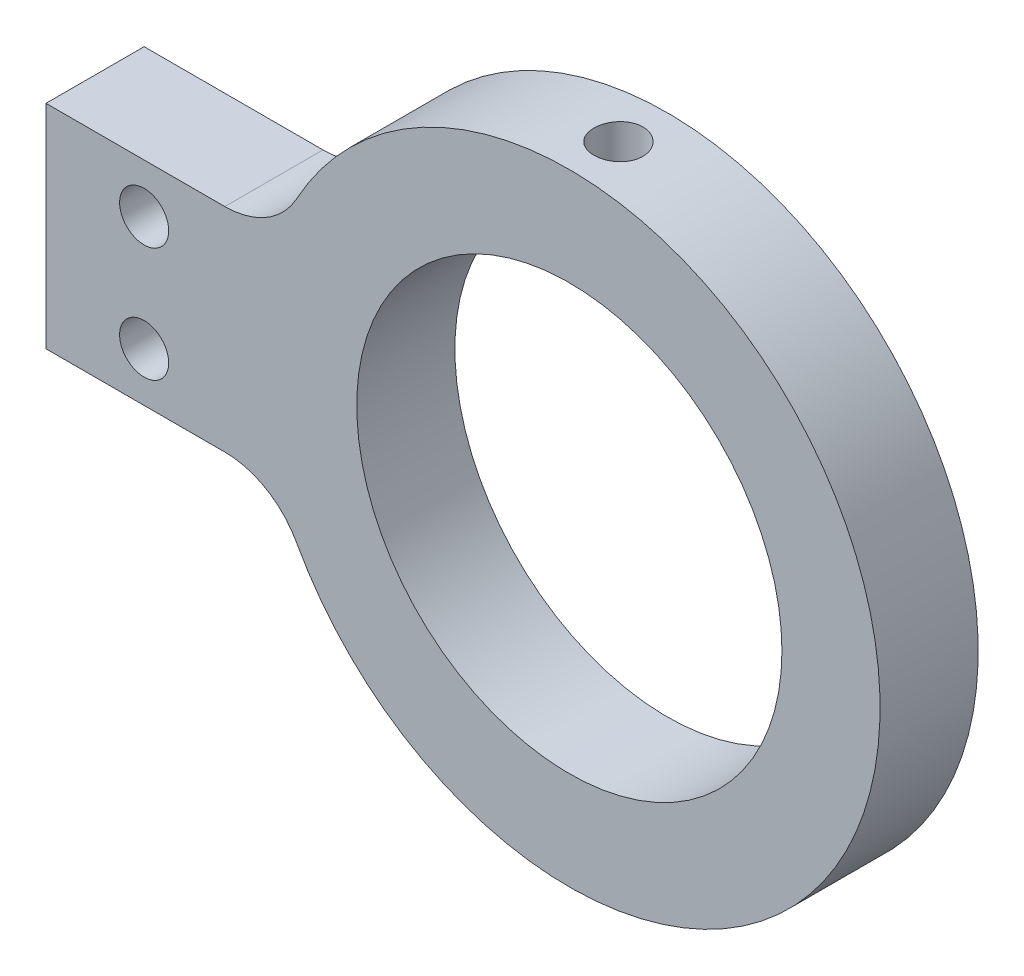
ISO-10303-21;
HEADER;
FILE_DESCRIPTION(('STEP AP214'),'2;1');
FILE_NAME('part.step','',(''),(''),'','','');
FILE_SCHEMA(('AUTOMOTIVE_DESIGN { 1 0 10303 214 1 1 1 1 }'));
ENDSEC;
DATA;
#1=APPLICATION_CONTEXT('core data for automotive mechanical design processes');
#2=APPLICATION_PROTOCOL_DEFINITION('international standard','automotive_design',2000,#1);
#3=PRODUCT_CONTEXT('',#1,'mechanical');
#4=PRODUCT('Part','Part','',(#3));
#5=PRODUCT_RELATED_PRODUCT_CATEGORY('part','',(#4));
#6=PRODUCT_DEFINITION_FORMATION('','',#4);
#7=PRODUCT_DEFINITION_CONTEXT('part definition',#1,'design');
#8=PRODUCT_DEFINITION('design','',#6,#7);
#9=PRODUCT_DEFINITION_SHAPE('','',#8);
#10=(LENGTH_UNIT() NAMED_UNIT(*) SI_UNIT(.MILLI.,.METRE.));
#11=(NAMED_UNIT(*) PLANE_ANGLE_UNIT() SI_UNIT($,.RADIAN.));
#12=(NAMED_UNIT(*) SI_UNIT($,.STERADIAN.) SOLID_ANGLE_UNIT());
#13=UNCERTAINTY_MEASURE_WITH_UNIT(LENGTH_MEASURE(1.E-05),#10,'distance_accuracy_value','');
#14=(GEOMETRIC_REPRESENTATION_CONTEXT(3) GLOBAL_UNCERTAINTY_ASSIGNED_CONTEXT((#13)) GLOBAL_UNIT_ASSIGNED_CONTEXT((#10,
#11,#12)) REPRESENTATION_CONTEXT('',''));
#15=CARTESIAN_POINT('',(0.,0.,0.));
#16=DIRECTION('',(0.,0.,1.));
#17=DIRECTION('',(1.,0.,0.));
#18=AXIS2_PLACEMENT_3D('',#15,#16,#17);
#19=CARTESIAN_POINT('',(0.,0.,3.));
#20=DIRECTION('',(0.,0.,-1.));
#21=DIRECTION('',(-1.,0.,0.));
#22=AXIS2_PLACEMENT_3D('',#19,#20,#21);
#23=CYLINDRICAL_SURFACE('',#22,19.);
#24=CARTESIAN_POINT('',(0.,0.,-3.));
#25=DIRECTION('',(0.,0.,1.));
#26=DIRECTION('',(1.,0.,0.));
#27=AXIS2_PLACEMENT_3D('',#24,#25,#26);
#28=CIRCLE('',#27,19.);
#29=CARTESIAN_POINT('',(-16.6767547594115,-9.10416666666666,-3.));
#30=VERTEX_POINT('',#29);
#31=CARTESIAN_POINT('',(-16.6767547594115,9.10416666666666,-3.));
#32=VERTEX_POINT('',#31);
#33=EDGE_CURVE('E112',#30,#32,#28,.T.);
#34=ORIENTED_EDGE('',*,*,#33,.T.);
#35=DIRECTION('',(0.,0.,-1.));
#36=VECTOR('',#35,1.);
#37=CARTESIAN_POINT('',(-16.6767547594115,9.10416666666666,3.));
#38=LINE('',#37,#36);
#39=CARTESIAN_POINT('',(-16.6767547594115,9.10416666666666,3.));
#40=VERTEX_POINT('',#39);
#41=EDGE_CURVE('E109',#40,#32,#38,.T.);
#42=ORIENTED_EDGE('',*,*,#41,.F.);
#43=CARTESIAN_POINT('',(0.,0.,3.));
#44=DIRECTION('',(0.,0.,1.));
#45=DIRECTION('',(1.,0.,0.));
#46=AXIS2_PLACEMENT_3D('',#43,#44,#45);
#47=CIRCLE('',#46,19.);
#48=CARTESIAN_POINT('',(-16.6767547594115,-9.10416666666666,3.));
#49=VERTEX_POINT('',#48);
#50=EDGE_CURVE('E97',#49,#40,#47,.T.);
#51=ORIENTED_EDGE('',*,*,#50,.F.);
#52=DIRECTION('',(0.,0.,-1.));
#53=VECTOR('',#52,1.);
#54=CARTESIAN_POINT('',(-16.6767547594115,-9.10416666666666,3.));
#55=LINE('',#54,#53);
#56=EDGE_CURVE('E113',#49,#30,#55,.T.);
#57=ORIENTED_EDGE('',*,*,#56,.T.);
#58=EDGE_LOOP('',(#34,#42,#51,#57));
#59=FACE_BOUND('',#58,.T.);
#60=CARTESIAN_POINT('',(0.,19.,-1.5));
#61=CARTESIAN_POINT('',(0.0841151387188532,18.999999221537,-1.49999631934173));
#62=CARTESIAN_POINT('',(0.168287922827548,18.9994354600354,-1.49290084958466));
#63=CARTESIAN_POINT('',(0.334305698598371,18.997240706404,-1.46469947465167));
#64=CARTESIAN_POINT('',(0.416147925046005,18.9956084974586,-1.44357759491472));
#65=CARTESIAN_POINT('',(0.575076027563788,18.9914613431667,-1.38793703178534));
#66=CARTESIAN_POINT('',(0.652164524677553,18.9889468894701,-1.35342580876111));
#67=CARTESIAN_POINT('',(0.799435680795712,18.9833174206842,-1.27199926981773));
#68=CARTESIAN_POINT('',(0.869619836810095,18.9802025362166,-1.22508665095823));
#69=CARTESIAN_POINT('',(1.00127051563137,18.9737138537755,-1.12007204663659));
#70=CARTESIAN_POINT('',(1.06271896083146,18.9703395405387,-1.06194742819675));
#71=CARTESIAN_POINT('',(1.1749989049417,18.9637166459802,-0.936206408029782));
#72=CARTESIAN_POINT('',(1.22582994292754,18.960468070122,-0.868589594439193));
#73=CARTESIAN_POINT('',(1.31549242293151,18.9544588143707,-0.725675328414236));
#74=CARTESIAN_POINT('',(1.3543081273485,18.951698776369,-0.650367973118573));
#75=CARTESIAN_POINT('',(1.41873755115466,18.9469848112354,-0.494279424529938));
#76=CARTESIAN_POINT('',(1.4443514822562,18.9450308711765,-0.413498319041156));
#77=CARTESIAN_POINT('',(1.48159822322927,18.9421545390237,-0.248935339909821));
#78=CARTESIAN_POINT('',(1.49326029941244,18.9412299879009,-0.165160128678885));
#79=CARTESIAN_POINT('',(1.50236268465663,18.9405102433779,0.00316340857499041));
#80=CARTESIAN_POINT('',(1.49980323578885,18.9407150307546,0.0877117214141516));
#81=CARTESIAN_POINT('',(1.48055943130006,18.9422288673013,0.254981155017642));
#82=CARTESIAN_POINT('',(1.46390684932512,18.9435354324364,0.337705956855369));
#83=CARTESIAN_POINT('',(1.41699882958061,18.9471017023429,0.499182607561633));
#84=CARTESIAN_POINT('',(1.38674327091875,18.9493614155851,0.57793442111453));
#85=CARTESIAN_POINT('',(1.31345245016364,18.9545822190074,0.729331074859556));
#86=CARTESIAN_POINT('',(1.2704028956484,18.9575440928322,0.801968967999395));
#87=CARTESIAN_POINT('',(1.17275641592226,18.9638347400174,0.938999893955222));
#88=CARTESIAN_POINT('',(1.11815928117868,18.9671635200349,1.00339277713015));
#89=CARTESIAN_POINT('',(0.998789069552185,18.9738239428695,1.12229057948029));
#90=CARTESIAN_POINT('',(0.933988517197367,18.9771555685343,1.17676791879317));
#91=CARTESIAN_POINT('',(0.796146882184882,18.9834375709718,1.27407509939559));
#92=CARTESIAN_POINT('',(0.723105794733443,18.9863879475227,1.31690493390936));
#93=CARTESIAN_POINT('',(0.570838809989568,18.991575496542,1.38969946273513));
#94=CARTESIAN_POINT('',(0.491612346167745,18.9938126035852,1.41966297696088));
#95=CARTESIAN_POINT('',(0.329231606345089,18.9973207725944,1.46585520971452));
#96=CARTESIAN_POINT('',(0.246077403532174,18.9985918525535,1.48208418405981));
#97=CARTESIAN_POINT('',(0.0784407393713425,19.0000224384176,1.50031217220341));
#98=CARTESIAN_POINT('',(-0.00603755448041892,19.0001849207592,1.50234928955241));
#99=CARTESIAN_POINT('',(-0.174134501687,18.9993879456588,1.49223549471702));
#100=CARTESIAN_POINT('',(-0.257753162221242,18.9984284975946,1.48008470112344));
#101=CARTESIAN_POINT('',(-0.421648876867877,18.9954975020934,1.44197157489794));
#102=CARTESIAN_POINT('',(-0.501930053359411,18.9935272459175,1.41602686183516));
#103=CARTESIAN_POINT('',(-0.656999501829893,18.9887960412095,1.35108034355391));
#104=CARTESIAN_POINT('',(-0.731787695596672,18.9860350814215,1.31207835246253));
#105=CARTESIAN_POINT('',(-0.873921875208904,18.9800247197833,1.22202835520065));
#106=CARTESIAN_POINT('',(-0.941251793864615,18.976774297697,1.17095505784873));
#107=CARTESIAN_POINT('',(-1.06639608992059,18.9701537726923,1.05824883025555));
#108=CARTESIAN_POINT('',(-1.12421031888409,18.9667836679079,0.996615735320939));
#109=CARTESIAN_POINT('',(-1.2288124248757,18.9602948383227,0.864374324175828));
#110=CARTESIAN_POINT('',(-1.27557547077564,18.9571766897926,0.793746334523397));
#111=CARTESIAN_POINT('',(-1.356577619136,18.9515527813904,0.645618147208736));
#112=CARTESIAN_POINT('',(-1.39081683559962,18.9490470159439,0.568118012110947));
#113=CARTESIAN_POINT('',(-1.44575693555035,18.94493468603,0.408534049893584));
#114=CARTESIAN_POINT('',(-1.46647311943612,18.9433271056248,0.326455517499473));
#115=CARTESIAN_POINT('',(-1.49382895011883,18.9411896745755,0.159971925186586));
#116=CARTESIAN_POINT('',(-1.50046883646069,18.9406598055914,0.075566904883834));
#117=CARTESIAN_POINT('',(-1.49948094344338,18.9407380213103,-0.092926929471462));
#118=CARTESIAN_POINT('',(-1.49189218322356,18.9413429939456,-0.177015976500801));
#119=CARTESIAN_POINT('',(-1.46274366938462,18.9436161189885,-0.342721436509556));
#120=CARTESIAN_POINT('',(-1.44118389337775,18.9452842730997,-0.424337845526495));
#121=CARTESIAN_POINT('',(-1.38471500507715,18.9494949902263,-0.582784498435055));
#122=CARTESIAN_POINT('',(-1.34980648222261,18.9520375146316,-0.659614953485356));
#123=CARTESIAN_POINT('',(-1.267635548191,18.9577105355609,-0.806330890474433));
#124=CARTESIAN_POINT('',(-1.22037336027397,18.9608410214587,-0.876216497891582));
#125=CARTESIAN_POINT('',(-1.11469031191135,18.967347409111,-1.007258401442));
#126=CARTESIAN_POINT('',(-1.05624065477126,18.9707239299605,-1.06839144257716));
#127=CARTESIAN_POINT('',(-0.92989212448948,18.977336317951,-1.18000278065208));
#128=CARTESIAN_POINT('',(-0.861990962632756,18.9805721507741,-1.23047848940779));
#129=CARTESIAN_POINT('',(-0.718548782250666,18.9865438065605,-1.31940271283776));
#130=CARTESIAN_POINT('',(-0.642994879159651,18.989278763737,-1.35783048218647));
#131=CARTESIAN_POINT('',(-0.486538032284914,18.9939300983643,-1.42140600094976));
#132=CARTESIAN_POINT('',(-0.405641386546964,18.9958474204367,-1.44656908316626));
#133=CARTESIAN_POINT('',(-0.270219385273123,18.9981528412889,-1.47646148286017));
#134=CARTESIAN_POINT('',(-0.216566049108645,18.9988423900528,-1.48527676958514));
#135=CARTESIAN_POINT('',(-0.108616487728126,18.9997662202352,-1.49704720975321));
#136=CARTESIAN_POINT('',(-0.0543202640171315,19.0000005027195,-1.50000237691255));
#137=CARTESIAN_POINT('',(0.,19.,-1.5));
#138=B_SPLINE_CURVE_WITH_KNOTS('',3,(#60,#61,#62,#63,#64,#65,#66,#67,#68,#69,#70,#71,#72,#73,
#74,#75,#76,#77,#78,#79,#80,#81,#82,#83,#84,#85,#86,#87,#88,#89,#90,#91,#92,#93,#94,#95,#96,#97,
#98,#99,#100,#101,#102,#103,#104,#105,#106,#107,#108,#109,#110,#111,#112,#113,#114,#115,#116,
#117,#118,#119,#120,#121,#122,#123,#124,#125,#126,#127,#128,#129,#130,#131,#132,#133,#134,#135,
#136,#137),.UNSPECIFIED.,.T.,.F.,(4,2,2,2,2,2,2,2,2,2,2,2,2,2,2,2,2,2,2,2,2,2,2,2,2,2,2,2,2,2,2,
2,2,2,2,2,2,2,4),(0.,0.252147094273371,0.504581850393633,0.756876154680071,1.00911563499452,
1.26186972745745,1.5146347902352,1.76772953561851,2.02082022208066,2.27337907304911,
2.52593362510898,2.77792029301404,3.02990920041797,3.28218067450637,3.53445672649365,
3.78742409874195,4.0403916181499,4.29338233453675,4.54636833865406,4.79867484092891,
5.05097923429394,5.30296211992513,5.55494859273475,5.80746776930199,6.05999088458261,
6.31307611620289,6.56615904395592,6.81895512684885,7.07174690772234,7.32384647280326,
7.57594644186007,7.82803528025071,8.08011956311296,8.33286165921681,8.58566506452426,
8.83890141074389,9.09184439276202,9.25467749271783,9.41751021154461),.UNSPECIFIED.);
#139=CARTESIAN_POINT('',(0.,19.,-1.5));
#140=VERTEX_POINT('',#139);
#141=EDGE_CURVE('E201',#140,#140,#138,.T.);
#142=ORIENTED_EDGE('',*,*,#141,.T.);
#143=EDGE_LOOP('',(#142));
#144=FACE_BOUND('',#143,.T.);
#145=ADVANCED_FACE('F36',(#59,#144),#23,.T.);
#146=CARTESIAN_POINT('',(0.,0.,3.));
#147=DIRECTION('',(0.,0.,-1.));
#148=DIRECTION('',(-1.,0.,0.));
#149=AXIS2_PLACEMENT_3D('',#146,#147,#148);
#150=CYLINDRICAL_SURFACE('',#149,13.);
#151=CARTESIAN_POINT('',(0.,0.,-3.));
#152=DIRECTION('',(0.,0.,1.));
#153=DIRECTION('',(1.,0.,0.));
#154=AXIS2_PLACEMENT_3D('',#151,#152,#153);
#155=CIRCLE('',#154,13.);
#156=CARTESIAN_POINT('',(13.,0.,-3.));
#157=VERTEX_POINT('',#156);
#158=EDGE_CURVE('E217',#157,#157,#155,.T.);
#159=ORIENTED_EDGE('',*,*,#158,.F.);
#160=EDGE_LOOP('',(#159));
#161=FACE_BOUND('',#160,.T.);
#162=CARTESIAN_POINT('',(0.,0.,3.));
#163=DIRECTION('',(0.,0.,1.));
#164=DIRECTION('',(1.,0.,0.));
#165=AXIS2_PLACEMENT_3D('',#162,#163,#164);
#166=CIRCLE('',#165,13.);
#167=CARTESIAN_POINT('',(13.,0.,3.));
#168=VERTEX_POINT('',#167);
#169=EDGE_CURVE('E126',#168,#168,#166,.T.);
#170=ORIENTED_EDGE('',*,*,#169,.T.);
#171=EDGE_LOOP('',(#170));
#172=FACE_BOUND('',#171,.T.);
#173=CARTESIAN_POINT('',(0.,13.,-1.5));
#174=CARTESIAN_POINT('',(0.0839563147427422,12.9999989044515,-1.4999964031671));
#175=CARTESIAN_POINT('',(0.167966345196187,12.999178081572,-1.4929275849652));
#176=CARTESIAN_POINT('',(0.333652235419372,12.995982599614,-1.46483826496663));
#177=CARTESIAN_POINT('',(0.415325505475653,12.9936062813601,-1.44380286531638));
#178=CARTESIAN_POINT('',(0.57391497224922,12.9875677351869,-1.38840533385725));
#179=CARTESIAN_POINT('',(0.650834199520698,12.9839063366207,-1.35405179569065));
#180=CARTESIAN_POINT('',(0.79779979378714,12.9757057473599,-1.27301111812132));
#181=CARTESIAN_POINT('',(0.867847413269117,12.9711667170809,-1.22632623210123));
#182=CARTESIAN_POINT('',(0.999427807179226,12.9616943551208,-1.12171196440118));
#183=CARTESIAN_POINT('',(1.06092347729183,12.9567594432832,-1.06373605262275));
#184=CARTESIAN_POINT('',(1.17333502414497,12.9470643855765,-0.938285163247563));
#185=CARTESIAN_POINT('',(1.2242503828419,12.9423042482743,-0.870809720796652));
#186=CARTESIAN_POINT('',(1.3141916873334,12.9334819604022,-0.728037336104839));
#187=CARTESIAN_POINT('',(1.3531833171573,12.9294218388056,-0.652718639922291));
#188=CARTESIAN_POINT('',(1.41795120910938,12.9224797052987,-0.496547838041185));
#189=CARTESIAN_POINT('',(1.44372790011126,12.9195976551562,-0.415695912012962));
#190=CARTESIAN_POINT('',(1.48122247723766,12.9153528047108,-0.251136475376288));
#191=CARTESIAN_POINT('',(1.49300261981048,12.9139832786549,-0.167443326259401));
#192=CARTESIAN_POINT('',(1.50236226854616,12.9128978570991,0.000742439544129054));
#193=CARTESIAN_POINT('',(1.49994226427626,12.9131819045903,0.085235028568845));
#194=CARTESIAN_POINT('',(1.48102150197295,12.9153653842397,0.252189313271096));
#195=CARTESIAN_POINT('',(1.46458907258954,12.9172569773873,0.334658869592594));
#196=CARTESIAN_POINT('',(1.41821640637187,12.9224301836669,0.495661894018248));
#197=CARTESIAN_POINT('',(1.38827593305336,12.9257118211342,0.574195293185667));
#198=CARTESIAN_POINT('',(1.31566282618376,12.9333043079058,0.725310469236094));
#199=CARTESIAN_POINT('',(1.27296024500285,12.9376175732259,0.797877729502273));
#200=CARTESIAN_POINT('',(1.17605655290097,12.9467853893456,0.934841729507241));
#201=CARTESIAN_POINT('',(1.12185499363063,12.9516399612475,0.999238150505508));
#202=CARTESIAN_POINT('',(1.0031120359915,12.9613782949516,1.11842928380831));
#203=CARTESIAN_POINT('',(0.938511694342139,12.9662620604919,1.17316529129794));
#204=CARTESIAN_POINT('',(0.80100859223603,12.9754816969276,1.27102561216758));
#205=CARTESIAN_POINT('',(0.728105817136099,12.9798175668567,1.31414990506731));
#206=CARTESIAN_POINT('',(0.576023905679871,12.9874550212078,1.38756171284481));
#207=CARTESIAN_POINT('',(0.496843118716625,12.9907563324875,1.41784583842859));
#208=CARTESIAN_POINT('',(0.334473831095743,12.9959501177405,1.46467252734239));
#209=CARTESIAN_POINT('',(0.251285490311374,12.9978426478647,1.48121563836297));
#210=CARTESIAN_POINT('',(0.0837704200050171,12.999998373659,1.50001527637962));
#211=CARTESIAN_POINT('',(-0.00054711354320089,13.0002707984128,1.50235272893189));
#212=CARTESIAN_POINT('',(-0.168372695685007,12.9991804669134,1.49288784538895));
#213=CARTESIAN_POINT('',(-0.251880758889224,12.9978177402298,1.48108576498777));
#214=CARTESIAN_POINT('',(-0.415480266956156,12.993616027243,1.443744027192));
#215=CARTESIAN_POINT('',(-0.495580568872891,12.9907811576039,1.41824267129123));
#216=CARTESIAN_POINT('',(-0.650367161714355,12.9839527929212,1.35426590377096));
#217=CARTESIAN_POINT('',(-0.725053293857113,12.9799592639147,1.31579011183556));
#218=CARTESIAN_POINT('',(-0.867254744569762,12.9712363785455,1.22675885487711));
#219=CARTESIAN_POINT('',(-0.934736878832462,12.9665038451426,1.17615070408719));
#220=CARTESIAN_POINT('',(-1.06027784673837,12.9568430886348,1.06436625518484));
#221=CARTESIAN_POINT('',(-1.11833636324618,12.9519148589511,1.00318960155086));
#222=CARTESIAN_POINT('',(-1.22366664140002,12.9423899602444,0.871649614664061));
#223=CARTESIAN_POINT('',(-1.27088497439797,12.9377950067668,0.801243356491106));
#224=CARTESIAN_POINT('',(-1.35282617315314,12.9294843210235,0.653452424155031));
#225=CARTESIAN_POINT('',(-1.38754925754463,12.9257685733744,0.576067872123489));
#226=CARTESIAN_POINT('',(-1.44342658284102,12.9196483466479,0.416693846264516));
#227=CARTESIAN_POINT('',(-1.46461162925533,12.91724089246,0.334715292069646));
#228=CARTESIAN_POINT('',(-1.49291104062265,12.9140010380224,0.16833506048564));
#229=CARTESIAN_POINT('',(-1.50002595610949,12.9131685761468,0.083933478035471));
#230=CARTESIAN_POINT('',(-1.49997405326828,12.9131745631781,-0.0843656537594237));
#231=CARTESIAN_POINT('',(-1.49289116482699,12.9140031925958,-0.168263241810996));
#232=CARTESIAN_POINT('',(-1.46482172327171,12.9172169582806,-0.333667501993218));
#233=CARTESIAN_POINT('',(-1.44383516225563,12.9196020954323,-0.415174172764976));
#234=CARTESIAN_POINT('',(-1.38857911797313,12.9256572251488,-0.573476091689344));
#235=CARTESIAN_POINT('',(-1.35431304208042,12.9293268880955,-0.650272542581184));
#236=CARTESIAN_POINT('',(-1.27347900341466,12.9375381901497,-0.797038400387884));
#237=CARTESIAN_POINT('',(-1.22691097725304,12.9420798337501,-0.867007772122138));
#238=CARTESIAN_POINT('',(-1.12248173071088,12.9515555600008,-0.998562953329314));
#239=CARTESIAN_POINT('',(-1.06455790771248,12.9564917239034,-1.06009892117499));
#240=CARTESIAN_POINT('',(-0.939190054186289,12.9661816355574,-1.17261111489076));
#241=CARTESIAN_POINT('',(-0.871743768617549,12.9709353397599,-1.22358483240877));
#242=CARTESIAN_POINT('',(-0.728996893197092,12.9797415177439,-1.31366356407028));
#243=CARTESIAN_POINT('',(-0.653671391511422,12.9837916526637,-1.35272930568544));
#244=CARTESIAN_POINT('',(-0.497527270565884,12.9907101076695,-1.41760310503946));
#245=CARTESIAN_POINT('',(-0.416714824913399,12.993579731148,-1.44342579213558));
#246=CARTESIAN_POINT('',(-0.27955630533205,12.9971099824635,-1.47479285483811));
#247=CARTESIAN_POINT('',(-0.224080319679961,12.9981885527758,-1.48423222713368));
#248=CARTESIAN_POINT('',(-0.112410914672188,12.9996339262189,-1.49683698528069));
#249=CARTESIAN_POINT('',(-0.0562174995863221,13.0000007335839,-1.50000240845436));
#250=CARTESIAN_POINT('',(0.,13.,-1.5));
#251=B_SPLINE_CURVE_WITH_KNOTS('',3,(#173,#174,#175,#176,#177,#178,#179,#180,#181,#182,#183,
#184,#185,#186,#187,#188,#189,#190,#191,#192,#193,#194,#195,#196,#197,#198,#199,#200,#201,#202,
#203,#204,#205,#206,#207,#208,#209,#210,#211,#212,#213,#214,#215,#216,#217,#218,#219,#220,#221,
#222,#223,#224,#225,#226,#227,#228,#229,#230,#231,#232,#233,#234,#235,#236,#237,#238,#239,#240,
#241,#242,#243,#244,#245,#246,#247,#248,#249,#250),.UNSPECIFIED.,.T.,.F.,(4,2,2,2,2,2,2,2,2,2,2,
2,2,2,2,2,2,2,2,2,2,2,2,2,2,2,2,2,2,2,2,2,2,2,2,2,2,2,4),(0.,0.251663624421979,
0.503596125244171,0.755366334321089,1.00709056767771,1.25987498270023,1.51267177188699,
1.76618939688668,2.0196987937799,2.27207631201581,2.52444512928255,2.77559031440111,
3.02673989646913,3.27848351780672,3.53023695652505,3.78347119880911,4.0367058877347,
4.29000737900444,4.54329877367693,4.79514587715501,5.04698842639316,5.29813049175019,
5.54927991940194,5.80154039645153,6.05380936112788,6.30729621090899,6.56077862511547,
6.81368217226278,7.0665758236448,7.31797891068329,7.56938214060554,7.82072090595902,
8.07206096641733,8.3248276967652,8.57765438622355,8.83130609524226,9.08467699305617,
9.25319301127889,9.42170802703663),.UNSPECIFIED.);
#252=CARTESIAN_POINT('',(0.,13.,-1.5));
#253=VERTEX_POINT('',#252);
#254=EDGE_CURVE('E196',#253,#253,#251,.T.);
#255=ORIENTED_EDGE('',*,*,#254,.F.);
#256=EDGE_LOOP('',(#255));
#257=FACE_BOUND('',#256,.T.);
#258=ADVANCED_FACE('F161',(#161,#172,#257),#150,.F.);
#259=CARTESIAN_POINT('',(-21.0653744329409,11.5,3.));
#260=DIRECTION('',(0.,0.,1.));
#261=DIRECTION('',(1.,0.,0.));
#262=AXIS2_PLACEMENT_3D('',#259,#260,#261);
#263=PLANE('',#262);
#264=CARTESIAN_POINT('',(-26.,3.5,3.));
#265=DIRECTION('',(0.,0.,1.));
#266=DIRECTION('',(1.,0.,0.));
#267=AXIS2_PLACEMENT_3D('',#264,#265,#266);
#268=CIRCLE('',#267,1.5);
#269=CARTESIAN_POINT('',(-24.5,3.5,3.));
#270=VERTEX_POINT('',#269);
#271=EDGE_CURVE('E214',#270,#270,#268,.T.);
#272=ORIENTED_EDGE('',*,*,#271,.F.);
#273=EDGE_LOOP('',(#272));
#274=FACE_BOUND('',#273,.T.);
#275=DIRECTION('',(0.,-1.,0.));
#276=VECTOR('',#275,1.);
#277=CARTESIAN_POINT('',(-32.,-6.50000000000001,3.));
#278=LINE('',#277,#276);
#279=CARTESIAN_POINT('',(-32.,6.49999999999999,3.));
#280=VERTEX_POINT('',#279);
#281=CARTESIAN_POINT('',(-32.,-6.50000000000001,3.));
#282=VERTEX_POINT('',#281);
#283=EDGE_CURVE('E133',#280,#282,#278,.T.);
#284=ORIENTED_EDGE('',*,*,#283,.T.);
#285=DIRECTION('',(1.,0.,0.));
#286=VECTOR('',#285,1.);
#287=CARTESIAN_POINT('',(-21.0653744329409,-6.5,3.));
#288=LINE('',#287,#286);
#289=CARTESIAN_POINT('',(-21.0653744329409,-6.5,3.));
#290=VERTEX_POINT('',#289);
#291=EDGE_CURVE('E90',#282,#290,#288,.T.);
#292=ORIENTED_EDGE('',*,*,#291,.T.);
#293=CARTESIAN_POINT('',(-21.0653744329409,-11.5,3.));
#294=DIRECTION('',(0.,0.,-1.));
#295=DIRECTION('',(-1.,0.,0.));
#296=AXIS2_PLACEMENT_3D('',#293,#294,#295);
#297=CIRCLE('',#296,5.);
#298=EDGE_CURVE('E104',#290,#49,#297,.T.);
#299=ORIENTED_EDGE('',*,*,#298,.T.);
#300=ORIENTED_EDGE('',*,*,#50,.T.);
#301=CARTESIAN_POINT('',(-21.0653744329409,11.5,3.));
#302=DIRECTION('',(0.,0.,-1.));
#303=DIRECTION('',(1.,0.,0.));
#304=AXIS2_PLACEMENT_3D('',#301,#302,#303);
#305=CIRCLE('',#304,5.);
#306=CARTESIAN_POINT('',(-21.0653744329409,6.5,3.));
#307=VERTEX_POINT('',#306);
#308=EDGE_CURVE('E102',#40,#307,#305,.T.);
#309=ORIENTED_EDGE('',*,*,#308,.T.);
#310=DIRECTION('',(-1.,0.,0.));
#311=VECTOR('',#310,1.);
#312=CARTESIAN_POINT('',(-21.0653744329409,6.5,3.));
#313=LINE('',#312,#311);
#314=EDGE_CURVE('E53',#307,#280,#313,.T.);
#315=ORIENTED_EDGE('',*,*,#314,.T.);
#316=EDGE_LOOP('',(#284,#292,#299,#300,#309,#315));
#317=FACE_BOUND('',#316,.T.);
#318=ORIENTED_EDGE('',*,*,#169,.F.);
#319=EDGE_LOOP('',(#318));
#320=FACE_BOUND('',#319,.T.);
#321=CARTESIAN_POINT('',(-26.,-3.5,3.));
#322=DIRECTION('',(0.,0.,1.));
#323=DIRECTION('',(-1.,0.,0.));
#324=AXIS2_PLACEMENT_3D('',#321,#322,#323);
#325=CIRCLE('',#324,1.5);
#326=CARTESIAN_POINT('',(-27.5,-3.5,3.));
#327=VERTEX_POINT('',#326);
#328=EDGE_CURVE('E207',#327,#327,#325,.T.);
#329=ORIENTED_EDGE('',*,*,#328,.F.);
#330=EDGE_LOOP('',(#329));
#331=FACE_BOUND('',#330,.T.);
#332=ADVANCED_FACE('F99',(#274,#317,#320,#331),#263,.T.);
#333=CARTESIAN_POINT('',(-21.0653744329409,11.5,-3.));
#334=DIRECTION('',(0.,0.,1.));
#335=DIRECTION('',(1.,0.,0.));
#336=AXIS2_PLACEMENT_3D('',#333,#334,#335);
#337=PLANE('',#336);
#338=DIRECTION('',(0.,-1.,0.));
#339=VECTOR('',#338,1.);
#340=CARTESIAN_POINT('',(-32.,-6.50000000000001,-3.));
#341=LINE('',#340,#339);
#342=CARTESIAN_POINT('',(-32.,6.49999999999999,-3.));
#343=VERTEX_POINT('',#342);
#344=CARTESIAN_POINT('',(-32.,-6.50000000000001,-3.));
#345=VERTEX_POINT('',#344);
#346=EDGE_CURVE('E122',#343,#345,#341,.T.);
#347=ORIENTED_EDGE('',*,*,#346,.F.);
#348=DIRECTION('',(-1.,0.,0.));
#349=VECTOR('',#348,1.);
#350=CARTESIAN_POINT('',(-21.0653744329409,6.5,-3.));
#351=LINE('',#350,#349);
#352=CARTESIAN_POINT('',(-21.0653744329409,6.5,-3.));
#353=VERTEX_POINT('',#352);
#354=EDGE_CURVE('E82',#353,#343,#351,.T.);
#355=ORIENTED_EDGE('',*,*,#354,.F.);
#356=CARTESIAN_POINT('',(-21.0653744329409,11.5,-3.));
#357=DIRECTION('',(0.,0.,-1.));
#358=DIRECTION('',(1.,0.,0.));
#359=AXIS2_PLACEMENT_3D('',#356,#357,#358);
#360=CIRCLE('',#359,5.);
#361=EDGE_CURVE('E76',#32,#353,#360,.T.);
#362=ORIENTED_EDGE('',*,*,#361,.F.);
#363=ORIENTED_EDGE('',*,*,#33,.F.);
#364=CARTESIAN_POINT('',(-21.0653744329409,-11.5,-3.));
#365=DIRECTION('',(0.,0.,-1.));
#366=DIRECTION('',(-1.,0.,0.));
#367=AXIS2_PLACEMENT_3D('',#364,#365,#366);
#368=CIRCLE('',#367,5.);
#369=CARTESIAN_POINT('',(-21.0653744329409,-6.5,-3.));
#370=VERTEX_POINT('',#369);
#371=EDGE_CURVE('E128',#370,#30,#368,.T.);
#372=ORIENTED_EDGE('',*,*,#371,.F.);
#373=DIRECTION('',(1.,0.,0.));
#374=VECTOR('',#373,1.);
#375=CARTESIAN_POINT('',(-21.0653744329409,-6.5,-3.));
#376=LINE('',#375,#374);
#377=EDGE_CURVE('E125',#345,#370,#376,.T.);
#378=ORIENTED_EDGE('',*,*,#377,.F.);
#379=EDGE_LOOP('',(#347,#355,#362,#363,#372,#378));
#380=FACE_BOUND('',#379,.T.);
#381=ORIENTED_EDGE('',*,*,#158,.T.);
#382=EDGE_LOOP('',(#381));
#383=FACE_BOUND('',#382,.T.);
#384=CARTESIAN_POINT('',(-26.,3.5,-3.));
#385=DIRECTION('',(0.,0.,1.));
#386=DIRECTION('',(1.,0.,0.));
#387=AXIS2_PLACEMENT_3D('',#384,#385,#386);
#388=CIRCLE('',#387,1.5);
#389=CARTESIAN_POINT('',(-24.5,3.5,-3.));
#390=VERTEX_POINT('',#389);
#391=EDGE_CURVE('E210',#390,#390,#388,.T.);
#392=ORIENTED_EDGE('',*,*,#391,.T.);
#393=EDGE_LOOP('',(#392));
#394=FACE_BOUND('',#393,.T.);
#395=CARTESIAN_POINT('',(-26.,-3.5,-3.));
#396=DIRECTION('',(0.,0.,1.));
#397=DIRECTION('',(-1.,0.,0.));
#398=AXIS2_PLACEMENT_3D('',#395,#396,#397);
#399=CIRCLE('',#398,1.5);
#400=CARTESIAN_POINT('',(-27.5,-3.5,-3.));
#401=VERTEX_POINT('',#400);
#402=EDGE_CURVE('E211',#401,#401,#399,.T.);
#403=ORIENTED_EDGE('',*,*,#402,.T.);
#404=EDGE_LOOP('',(#403));
#405=FACE_BOUND('',#404,.T.);
#406=ADVANCED_FACE('F142',(#380,#383,#394,#405),#337,.F.);
#407=CARTESIAN_POINT('',(-32.,-6.50000000000001,3.));
#408=DIRECTION('',(1.,0.,0.));
#409=DIRECTION('',(0.,0.,-1.));
#410=AXIS2_PLACEMENT_3D('',#407,#408,#409);
#411=PLANE('',#410);
#412=ORIENTED_EDGE('',*,*,#346,.T.);
#413=DIRECTION('',(0.,0.,-1.));
#414=VECTOR('',#413,1.);
#415=CARTESIAN_POINT('',(-32.,-6.50000000000001,3.));
#416=LINE('',#415,#414);
#417=EDGE_CURVE('E11',#282,#345,#416,.T.);
#418=ORIENTED_EDGE('',*,*,#417,.F.);
#419=ORIENTED_EDGE('',*,*,#283,.F.);
#420=DIRECTION('',(0.,0.,-1.));
#421=VECTOR('',#420,1.);
#422=CARTESIAN_POINT('',(-32.,6.49999999999999,3.));
#423=LINE('',#422,#421);
#424=EDGE_CURVE('E118',#280,#343,#423,.T.);
#425=ORIENTED_EDGE('',*,*,#424,.T.);
#426=EDGE_LOOP('',(#412,#418,#419,#425));
#427=FACE_BOUND('',#426,.T.);
#428=ADVANCED_FACE('F38',(#427),#411,.F.);
#429=CARTESIAN_POINT('',(-21.0653744329409,-6.5,3.));
#430=DIRECTION('',(0.,1.,0.));
#431=DIRECTION('',(-1.,0.,0.));
#432=AXIS2_PLACEMENT_3D('',#429,#430,#431);
#433=PLANE('',#432);
#434=ORIENTED_EDGE('',*,*,#377,.T.);
#435=DIRECTION('',(0.,0.,-1.));
#436=VECTOR('',#435,1.);
#437=CARTESIAN_POINT('',(-21.0653744329409,-6.5,3.));
#438=LINE('',#437,#436);
#439=EDGE_CURVE('E45',#290,#370,#438,.T.);
#440=ORIENTED_EDGE('',*,*,#439,.F.);
#441=ORIENTED_EDGE('',*,*,#291,.F.);
#442=ORIENTED_EDGE('',*,*,#417,.T.);
#443=EDGE_LOOP('',(#434,#440,#441,#442));
#444=FACE_BOUND('',#443,.T.);
#445=ADVANCED_FACE('F170',(#444),#433,.F.);
#446=CARTESIAN_POINT('',(-21.0653744329409,-11.5,3.));
#447=DIRECTION('',(0.,0.,-1.));
#448=DIRECTION('',(-1.,0.,0.));
#449=AXIS2_PLACEMENT_3D('',#446,#447,#448);
#450=CYLINDRICAL_SURFACE('',#449,5.);
#451=ORIENTED_EDGE('',*,*,#371,.T.);
#452=ORIENTED_EDGE('',*,*,#56,.F.);
#453=ORIENTED_EDGE('',*,*,#298,.F.);
#454=ORIENTED_EDGE('',*,*,#439,.T.);
#455=EDGE_LOOP('',(#451,#452,#453,#454));
#456=FACE_BOUND('',#455,.T.);
#457=ADVANCED_FACE('F139',(#456),#450,.F.);
#458=CARTESIAN_POINT('',(-21.0653744329409,11.5,3.));
#459=DIRECTION('',(0.,0.,-1.));
#460=DIRECTION('',(-1.,0.,0.));
#461=AXIS2_PLACEMENT_3D('',#458,#459,#460);
#462=CYLINDRICAL_SURFACE('',#461,5.);
#463=ORIENTED_EDGE('',*,*,#361,.T.);
#464=DIRECTION('',(0.,0.,-1.));
#465=VECTOR('',#464,1.);
#466=CARTESIAN_POINT('',(-21.0653744329409,6.5,3.));
#467=LINE('',#466,#465);
#468=EDGE_CURVE('E114',#307,#353,#467,.T.);
#469=ORIENTED_EDGE('',*,*,#468,.F.);
#470=ORIENTED_EDGE('',*,*,#308,.F.);
#471=ORIENTED_EDGE('',*,*,#41,.T.);
#472=EDGE_LOOP('',(#463,#469,#470,#471));
#473=FACE_BOUND('',#472,.T.);
#474=ADVANCED_FACE('F116',(#473),#462,.F.);
#475=CARTESIAN_POINT('',(-21.0653744329409,6.5,3.));
#476=DIRECTION('',(0.,-1.,0.));
#477=DIRECTION('',(1.,0.,0.));
#478=AXIS2_PLACEMENT_3D('',#475,#476,#477);
#479=PLANE('',#478);
#480=ORIENTED_EDGE('',*,*,#354,.T.);
#481=ORIENTED_EDGE('',*,*,#424,.F.);
#482=ORIENTED_EDGE('',*,*,#314,.F.);
#483=ORIENTED_EDGE('',*,*,#468,.T.);
#484=EDGE_LOOP('',(#480,#481,#482,#483));
#485=FACE_BOUND('',#484,.T.);
#486=ADVANCED_FACE('F147',(#485),#479,.F.);
#487=CARTESIAN_POINT('',(-26.,3.5,3.));
#488=DIRECTION('',(0.,0.,-1.));
#489=DIRECTION('',(-1.,0.,0.));
#490=AXIS2_PLACEMENT_3D('',#487,#488,#489);
#491=CYLINDRICAL_SURFACE('',#490,1.5);
#492=ORIENTED_EDGE('',*,*,#271,.T.);
#493=EDGE_LOOP('',(#492));
#494=FACE_BOUND('',#493,.T.);
#495=ORIENTED_EDGE('',*,*,#391,.F.);
#496=EDGE_LOOP('',(#495));
#497=FACE_BOUND('',#496,.T.);
#498=ADVANCED_FACE('F149',(#494,#497),#491,.F.);
#499=CARTESIAN_POINT('',(-26.,-3.5,3.));
#500=DIRECTION('',(0.,0.,-1.));
#501=DIRECTION('',(-1.,0.,0.));
#502=AXIS2_PLACEMENT_3D('',#499,#500,#501);
#503=CYLINDRICAL_SURFACE('',#502,1.5);
#504=ORIENTED_EDGE('',*,*,#328,.T.);
#505=EDGE_LOOP('',(#504));
#506=FACE_BOUND('',#505,.T.);
#507=ORIENTED_EDGE('',*,*,#402,.F.);
#508=EDGE_LOOP('',(#507));
#509=FACE_BOUND('',#508,.T.);
#510=ADVANCED_FACE('F155',(#506,#509),#503,.F.);
#511=CARTESIAN_POINT('',(0.,19.001,0.));
#512=DIRECTION('',(0.,-1.,0.));
#513=DIRECTION('',(0.,0.,-1.));
#514=AXIS2_PLACEMENT_3D('',#511,#512,#513);
#515=CYLINDRICAL_SURFACE('',#514,1.5);
#516=ORIENTED_EDGE('',*,*,#254,.T.);
#517=EDGE_LOOP('',(#516));
#518=FACE_BOUND('',#517,.T.);
#519=ORIENTED_EDGE('',*,*,#141,.F.);
#520=EDGE_LOOP('',(#519));
#521=FACE_BOUND('',#520,.T.);
#522=ADVANCED_FACE('F186',(#518,#521),#515,.F.);
#523=CLOSED_SHELL('',(#145,#258,#332,#406,#428,#445,#457,#474,#486,#498,#510,#522));
#524=MANIFOLD_SOLID_BREP('B2',#523);
#525=ADVANCED_BREP_SHAPE_REPRESENTATION('',(#18,#524),#14);
#526=SHAPE_DEFINITION_REPRESENTATION(#9,#525);
ENDSEC;
END-ISO-10303-21;
